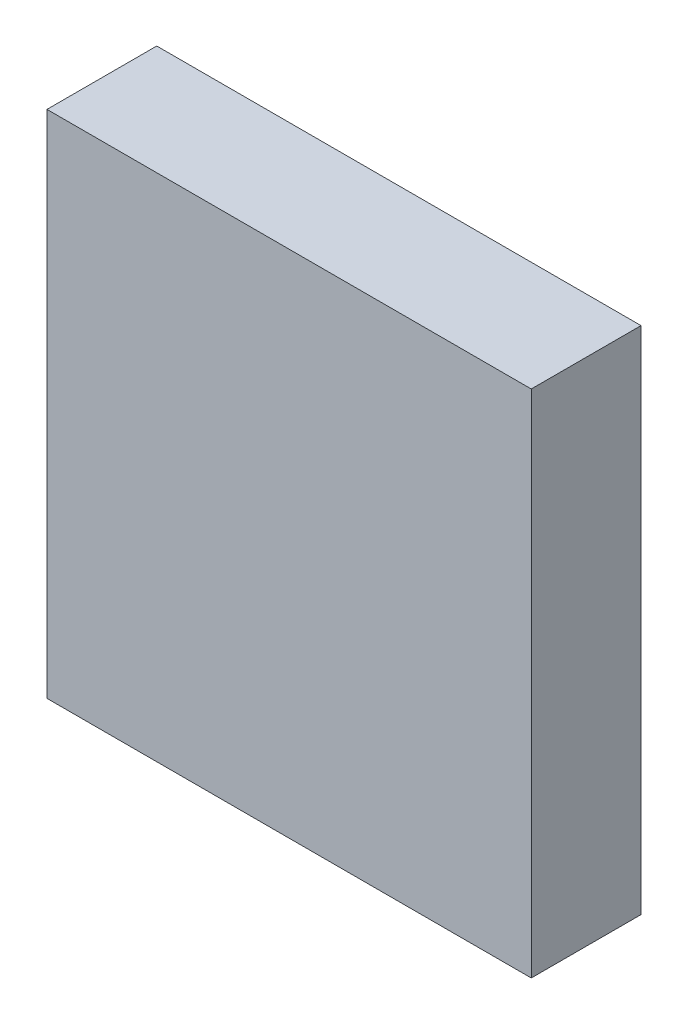
ISO-10303-21;
HEADER;
FILE_DESCRIPTION(('STEP AP214'),'2;1');
FILE_NAME('part.step','',(''),(''),'','','');
FILE_SCHEMA(('AUTOMOTIVE_DESIGN { 1 0 10303 214 1 1 1 1 }'));
ENDSEC;
DATA;
#1=APPLICATION_CONTEXT('core data for automotive mechanical design processes');
#2=APPLICATION_PROTOCOL_DEFINITION('international standard','automotive_design',2000,#1);
#3=PRODUCT_CONTEXT('',#1,'mechanical');
#4=PRODUCT('Part','Part','',(#3));
#5=PRODUCT_RELATED_PRODUCT_CATEGORY('part','',(#4));
#6=PRODUCT_DEFINITION_FORMATION('','',#4);
#7=PRODUCT_DEFINITION_CONTEXT('part definition',#1,'design');
#8=PRODUCT_DEFINITION('design','',#6,#7);
#9=PRODUCT_DEFINITION_SHAPE('','',#8);
#10=(LENGTH_UNIT() NAMED_UNIT(*) SI_UNIT(.MILLI.,.METRE.));
#11=(NAMED_UNIT(*) PLANE_ANGLE_UNIT() SI_UNIT($,.RADIAN.));
#12=(NAMED_UNIT(*) SI_UNIT($,.STERADIAN.) SOLID_ANGLE_UNIT());
#13=UNCERTAINTY_MEASURE_WITH_UNIT(LENGTH_MEASURE(1.E-05),#10,'distance_accuracy_value','');
#14=(GEOMETRIC_REPRESENTATION_CONTEXT(3) GLOBAL_UNCERTAINTY_ASSIGNED_CONTEXT((#13)) GLOBAL_UNIT_ASSIGNED_CONTEXT((#10,
#11,#12)) REPRESENTATION_CONTEXT('',''));
#15=CARTESIAN_POINT('',(0.,0.,0.));
#16=DIRECTION('',(0.,0.,1.));
#17=DIRECTION('',(1.,0.,0.));
#18=AXIS2_PLACEMENT_3D('',#15,#16,#17);
#19=CARTESIAN_POINT('',(37.5,39.5,17.));
#20=DIRECTION('',(-1.,0.,0.));
#21=DIRECTION('',(0.,-1.,0.));
#22=AXIS2_PLACEMENT_3D('',#19,#20,#21);
#23=PLANE('',#22);
#24=DIRECTION('',(0.,1.,0.));
#25=VECTOR('',#24,1.);
#26=CARTESIAN_POINT('',(37.5,39.5,0.));
#27=LINE('',#26,#25);
#28=CARTESIAN_POINT('',(37.5,-39.5,0.));
#29=VERTEX_POINT('',#28);
#30=CARTESIAN_POINT('',(37.5,39.5,0.));
#31=VERTEX_POINT('',#30);
#32=EDGE_CURVE('E100',#29,#31,#27,.T.);
#33=ORIENTED_EDGE('',*,*,#32,.T.);
#34=DIRECTION('',(0.,0.,-1.));
#35=VECTOR('',#34,1.);
#36=CARTESIAN_POINT('',(37.5,39.5,17.));
#37=LINE('',#36,#35);
#38=CARTESIAN_POINT('',(37.5,39.5,17.));
#39=VERTEX_POINT('',#38);
#40=EDGE_CURVE('E11',#39,#31,#37,.T.);
#41=ORIENTED_EDGE('',*,*,#40,.F.);
#42=DIRECTION('',(0.,1.,0.));
#43=VECTOR('',#42,1.);
#44=CARTESIAN_POINT('',(37.5,39.5,17.));
#45=LINE('',#44,#43);
#46=CARTESIAN_POINT('',(37.5,-39.5,17.));
#47=VERTEX_POINT('',#46);
#48=EDGE_CURVE('E88',#47,#39,#45,.T.);
#49=ORIENTED_EDGE('',*,*,#48,.F.);
#50=DIRECTION('',(0.,0.,-1.));
#51=VECTOR('',#50,1.);
#52=CARTESIAN_POINT('',(37.5,-39.5,17.));
#53=LINE('',#52,#51);
#54=EDGE_CURVE('E96',#47,#29,#53,.T.);
#55=ORIENTED_EDGE('',*,*,#54,.T.);
#56=EDGE_LOOP('',(#33,#41,#49,#55));
#57=FACE_BOUND('',#56,.T.);
#58=ADVANCED_FACE('F37',(#57),#23,.F.);
#59=CARTESIAN_POINT('',(-37.5,39.5,17.));
#60=DIRECTION('',(0.,-1.,0.));
#61=DIRECTION('',(0.,0.,-1.));
#62=AXIS2_PLACEMENT_3D('',#59,#60,#61);
#63=PLANE('',#62);
#64=DIRECTION('',(-1.,0.,0.));
#65=VECTOR('',#64,1.);
#66=CARTESIAN_POINT('',(-37.5,39.5,0.));
#67=LINE('',#66,#65);
#68=CARTESIAN_POINT('',(-37.5,39.5,0.));
#69=VERTEX_POINT('',#68);
#70=EDGE_CURVE('E92',#31,#69,#67,.T.);
#71=ORIENTED_EDGE('',*,*,#70,.T.);
#72=DIRECTION('',(0.,0.,-1.));
#73=VECTOR('',#72,1.);
#74=CARTESIAN_POINT('',(-37.5,39.5,17.));
#75=LINE('',#74,#73);
#76=CARTESIAN_POINT('',(-37.5,39.5,17.));
#77=VERTEX_POINT('',#76);
#78=EDGE_CURVE('E45',#77,#69,#75,.T.);
#79=ORIENTED_EDGE('',*,*,#78,.F.);
#80=DIRECTION('',(-1.,0.,0.));
#81=VECTOR('',#80,1.);
#82=CARTESIAN_POINT('',(-37.5,39.5,17.));
#83=LINE('',#82,#81);
#84=EDGE_CURVE('E83',#39,#77,#83,.T.);
#85=ORIENTED_EDGE('',*,*,#84,.F.);
#86=ORIENTED_EDGE('',*,*,#40,.T.);
#87=EDGE_LOOP('',(#71,#79,#85,#86));
#88=FACE_BOUND('',#87,.T.);
#89=ADVANCED_FACE('F91',(#88),#63,.F.);
#90=CARTESIAN_POINT('',(-37.5,39.5,17.));
#91=DIRECTION('',(1.,0.,0.));
#92=DIRECTION('',(0.,1.,0.));
#93=AXIS2_PLACEMENT_3D('',#90,#91,#92);
#94=PLANE('',#93);
#95=DIRECTION('',(0.,-1.,0.));
#96=VECTOR('',#95,1.);
#97=CARTESIAN_POINT('',(-37.5,39.5,0.));
#98=LINE('',#97,#96);
#99=CARTESIAN_POINT('',(-37.5,-39.5,0.));
#100=VERTEX_POINT('',#99);
#101=EDGE_CURVE('E70',#69,#100,#98,.T.);
#102=ORIENTED_EDGE('',*,*,#101,.T.);
#103=DIRECTION('',(0.,0.,-1.));
#104=VECTOR('',#103,1.);
#105=CARTESIAN_POINT('',(-37.5,-39.5,17.));
#106=LINE('',#105,#104);
#107=CARTESIAN_POINT('',(-37.5,-39.5,17.));
#108=VERTEX_POINT('',#107);
#109=EDGE_CURVE('E93',#108,#100,#106,.T.);
#110=ORIENTED_EDGE('',*,*,#109,.F.);
#111=DIRECTION('',(0.,-1.,0.));
#112=VECTOR('',#111,1.);
#113=CARTESIAN_POINT('',(-37.5,39.5,17.));
#114=LINE('',#113,#112);
#115=EDGE_CURVE('E86',#77,#108,#114,.T.);
#116=ORIENTED_EDGE('',*,*,#115,.F.);
#117=ORIENTED_EDGE('',*,*,#78,.T.);
#118=EDGE_LOOP('',(#102,#110,#116,#117));
#119=FACE_BOUND('',#118,.T.);
#120=ADVANCED_FACE('F94',(#119),#94,.F.);
#121=CARTESIAN_POINT('',(-37.5,-39.5,17.));
#122=DIRECTION('',(0.,1.,0.));
#123=DIRECTION('',(0.,0.,1.));
#124=AXIS2_PLACEMENT_3D('',#121,#122,#123);
#125=PLANE('',#124);
#126=DIRECTION('',(1.,0.,0.));
#127=VECTOR('',#126,1.);
#128=CARTESIAN_POINT('',(-37.5,-39.5,0.));
#129=LINE('',#128,#127);
#130=EDGE_CURVE('E76',#100,#29,#129,.T.);
#131=ORIENTED_EDGE('',*,*,#130,.T.);
#132=ORIENTED_EDGE('',*,*,#54,.F.);
#133=DIRECTION('',(1.,0.,0.));
#134=VECTOR('',#133,1.);
#135=CARTESIAN_POINT('',(-37.5,-39.5,17.));
#136=LINE('',#135,#134);
#137=EDGE_CURVE('E53',#108,#47,#136,.T.);
#138=ORIENTED_EDGE('',*,*,#137,.F.);
#139=ORIENTED_EDGE('',*,*,#109,.T.);
#140=EDGE_LOOP('',(#131,#132,#138,#139));
#141=FACE_BOUND('',#140,.T.);
#142=ADVANCED_FACE('F107',(#141),#125,.F.);
#143=CARTESIAN_POINT('',(0.,0.,17.));
#144=DIRECTION('',(0.,0.,1.));
#145=DIRECTION('',(1.,0.,0.));
#146=AXIS2_PLACEMENT_3D('',#143,#144,#145);
#147=PLANE('',#146);
#148=ORIENTED_EDGE('',*,*,#48,.T.);
#149=ORIENTED_EDGE('',*,*,#84,.T.);
#150=ORIENTED_EDGE('',*,*,#115,.T.);
#151=ORIENTED_EDGE('',*,*,#137,.T.);
#152=EDGE_LOOP('',(#148,#149,#150,#151));
#153=FACE_BOUND('',#152,.T.);
#154=ADVANCED_FACE('F84',(#153),#147,.T.);
#155=CARTESIAN_POINT('',(0.,0.,0.));
#156=DIRECTION('',(0.,0.,1.));
#157=DIRECTION('',(1.,0.,0.));
#158=AXIS2_PLACEMENT_3D('',#155,#156,#157);
#159=PLANE('',#158);
#160=ORIENTED_EDGE('',*,*,#32,.F.);
#161=ORIENTED_EDGE('',*,*,#130,.F.);
#162=ORIENTED_EDGE('',*,*,#101,.F.);
#163=ORIENTED_EDGE('',*,*,#70,.F.);
#164=EDGE_LOOP('',(#160,#161,#162,#163));
#165=FACE_BOUND('',#164,.T.);
#166=ADVANCED_FACE('F110',(#165),#159,.F.);
#167=CLOSED_SHELL('',(#58,#89,#120,#142,#154,#166));
#168=MANIFOLD_SOLID_BREP('B2',#167);
#169=ADVANCED_BREP_SHAPE_REPRESENTATION('',(#18,#168),#14);
#170=SHAPE_DEFINITION_REPRESENTATION(#9,#169);
ENDSEC;
END-ISO-10303-21;
